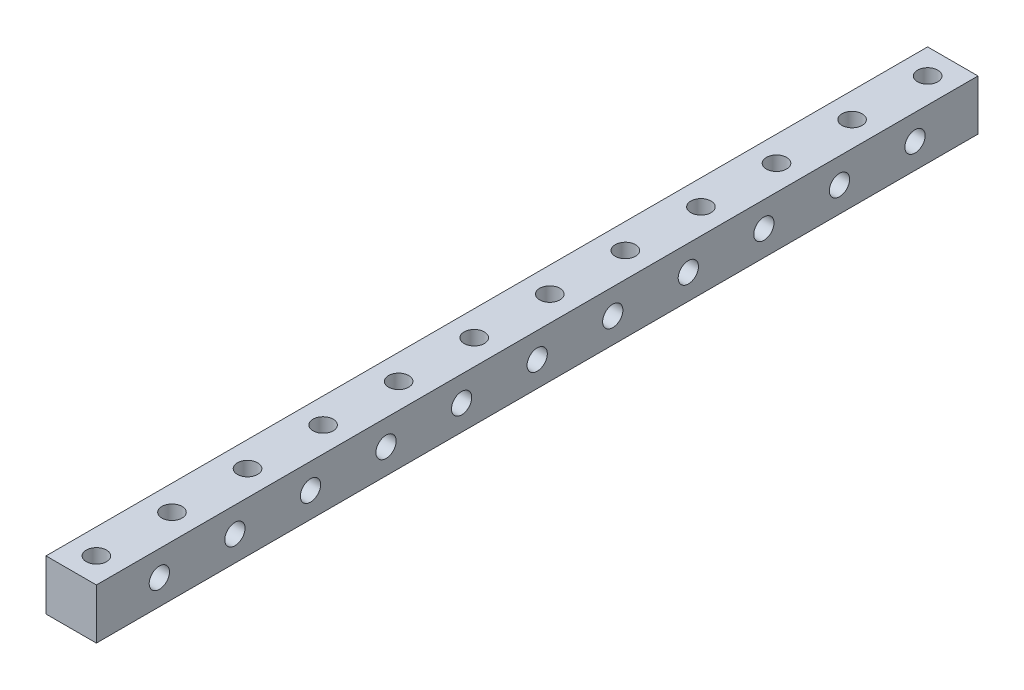
ISO-10303-21;
HEADER;
FILE_DESCRIPTION(('STEP AP214'),'2;1');
FILE_NAME('part.step','',(''),(''),'','','');
FILE_SCHEMA(('AUTOMOTIVE_DESIGN { 1 0 10303 214 1 1 1 1 }'));
ENDSEC;
DATA;
#1=APPLICATION_CONTEXT('core data for automotive mechanical design processes');
#2=APPLICATION_PROTOCOL_DEFINITION('international standard','automotive_design',2000,#1);
#3=PRODUCT_CONTEXT('',#1,'mechanical');
#4=PRODUCT('Part','Part','',(#3));
#5=PRODUCT_RELATED_PRODUCT_CATEGORY('part','',(#4));
#6=PRODUCT_DEFINITION_FORMATION('','',#4);
#7=PRODUCT_DEFINITION_CONTEXT('part definition',#1,'design');
#8=PRODUCT_DEFINITION('design','',#6,#7);
#9=PRODUCT_DEFINITION_SHAPE('','',#8);
#10=(LENGTH_UNIT() NAMED_UNIT(*) SI_UNIT(.MILLI.,.METRE.));
#11=(NAMED_UNIT(*) PLANE_ANGLE_UNIT() SI_UNIT($,.RADIAN.));
#12=(NAMED_UNIT(*) SI_UNIT($,.STERADIAN.) SOLID_ANGLE_UNIT());
#13=UNCERTAINTY_MEASURE_WITH_UNIT(LENGTH_MEASURE(1.E-05),#10,'distance_accuracy_value','');
#14=(GEOMETRIC_REPRESENTATION_CONTEXT(3) GLOBAL_UNCERTAINTY_ASSIGNED_CONTEXT((#13)) GLOBAL_UNIT_ASSIGNED_CONTEXT((#10,
#11,#12)) REPRESENTATION_CONTEXT('',''));
#15=CARTESIAN_POINT('',(0.,0.,0.));
#16=DIRECTION('',(0.,0.,1.));
#17=DIRECTION('',(1.,0.,0.));
#18=AXIS2_PLACEMENT_3D('',#15,#16,#17);
#19=CARTESIAN_POINT('',(6.35,0.,-206.375));
#20=DIRECTION('',(1.,0.,0.));
#21=DIRECTION('',(0.,0.,-1.));
#22=AXIS2_PLACEMENT_3D('',#19,#20,#21);
#23=CYLINDRICAL_SURFACE('',#22,2.55269999999999);
#24=CARTESIAN_POINT('',(6.35,0.,-206.375));
#25=DIRECTION('',(1.,0.,0.));
#26=DIRECTION('',(0.,0.,-1.));
#27=AXIS2_PLACEMENT_3D('',#24,#25,#26);
#28=CIRCLE('',#27,2.55269999999999);
#29=CARTESIAN_POINT('',(6.35,0.,-208.9277));
#30=VERTEX_POINT('',#29);
#31=EDGE_CURVE('E132',#30,#30,#28,.F.);
#32=ORIENTED_EDGE('',*,*,#31,.F.);
#33=EDGE_LOOP('',(#32));
#34=FACE_BOUND('',#33,.T.);
#35=CARTESIAN_POINT('',(-6.35,0.,-206.375));
#36=DIRECTION('',(1.,0.,0.));
#37=DIRECTION('',(0.,0.,-1.));
#38=AXIS2_PLACEMENT_3D('',#35,#36,#37);
#39=CIRCLE('',#38,2.55269999999999);
#40=CARTESIAN_POINT('',(-6.35,0.,-208.9277));
#41=VERTEX_POINT('',#40);
#42=EDGE_CURVE('E223',#41,#41,#39,.T.);
#43=ORIENTED_EDGE('',*,*,#42,.F.);
#44=EDGE_LOOP('',(#43));
#45=FACE_BOUND('',#44,.T.);
#46=ADVANCED_FACE('F50',(#34,#45),#23,.F.);
#47=CARTESIAN_POINT('',(6.35,0.,-187.325));
#48=DIRECTION('',(1.,0.,0.));
#49=DIRECTION('',(0.,0.,-1.));
#50=AXIS2_PLACEMENT_3D('',#47,#48,#49);
#51=CYLINDRICAL_SURFACE('',#50,2.55269999999999);
#52=CARTESIAN_POINT('',(6.35,0.,-187.325));
#53=DIRECTION('',(1.,0.,0.));
#54=DIRECTION('',(0.,0.,-1.));
#55=AXIS2_PLACEMENT_3D('',#52,#53,#54);
#56=CIRCLE('',#55,2.55269999999999);
#57=CARTESIAN_POINT('',(6.35,0.,-189.8777));
#58=VERTEX_POINT('',#57);
#59=EDGE_CURVE('E373',#58,#58,#56,.F.);
#60=ORIENTED_EDGE('',*,*,#59,.F.);
#61=EDGE_LOOP('',(#60));
#62=FACE_BOUND('',#61,.T.);
#63=CARTESIAN_POINT('',(-6.35,0.,-187.325));
#64=DIRECTION('',(1.,0.,0.));
#65=DIRECTION('',(0.,0.,-1.));
#66=AXIS2_PLACEMENT_3D('',#63,#64,#65);
#67=CIRCLE('',#66,2.55269999999999);
#68=CARTESIAN_POINT('',(-6.35,0.,-189.8777));
#69=VERTEX_POINT('',#68);
#70=EDGE_CURVE('E169',#69,#69,#67,.T.);
#71=ORIENTED_EDGE('',*,*,#70,.F.);
#72=EDGE_LOOP('',(#71));
#73=FACE_BOUND('',#72,.T.);
#74=ADVANCED_FACE('F385',(#62,#73),#51,.F.);
#75=CARTESIAN_POINT('',(6.35,0.,-168.275));
#76=DIRECTION('',(1.,0.,0.));
#77=DIRECTION('',(0.,0.,-1.));
#78=AXIS2_PLACEMENT_3D('',#75,#76,#77);
#79=CYLINDRICAL_SURFACE('',#78,2.55269999999999);
#80=CARTESIAN_POINT('',(6.35,0.,-168.275));
#81=DIRECTION('',(1.,0.,0.));
#82=DIRECTION('',(0.,0.,-1.));
#83=AXIS2_PLACEMENT_3D('',#80,#81,#82);
#84=CIRCLE('',#83,2.55269999999999);
#85=CARTESIAN_POINT('',(6.35,0.,-170.8277));
#86=VERTEX_POINT('',#85);
#87=EDGE_CURVE('E370',#86,#86,#84,.F.);
#88=ORIENTED_EDGE('',*,*,#87,.F.);
#89=EDGE_LOOP('',(#88));
#90=FACE_BOUND('',#89,.T.);
#91=CARTESIAN_POINT('',(-6.35,0.,-168.275));
#92=DIRECTION('',(1.,0.,0.));
#93=DIRECTION('',(0.,0.,-1.));
#94=AXIS2_PLACEMENT_3D('',#91,#92,#93);
#95=CIRCLE('',#94,2.55269999999999);
#96=CARTESIAN_POINT('',(-6.35,0.,-170.8277));
#97=VERTEX_POINT('',#96);
#98=EDGE_CURVE('E219',#97,#97,#95,.T.);
#99=ORIENTED_EDGE('',*,*,#98,.F.);
#100=EDGE_LOOP('',(#99));
#101=FACE_BOUND('',#100,.T.);
#102=ADVANCED_FACE('F389',(#90,#101),#79,.F.);
#103=CARTESIAN_POINT('',(6.35,0.,-149.225));
#104=DIRECTION('',(1.,0.,0.));
#105=DIRECTION('',(0.,0.,-1.));
#106=AXIS2_PLACEMENT_3D('',#103,#104,#105);
#107=CYLINDRICAL_SURFACE('',#106,2.55269999999999);
#108=CARTESIAN_POINT('',(6.35,0.,-149.225));
#109=DIRECTION('',(1.,0.,0.));
#110=DIRECTION('',(0.,0.,-1.));
#111=AXIS2_PLACEMENT_3D('',#108,#109,#110);
#112=CIRCLE('',#111,2.55269999999999);
#113=CARTESIAN_POINT('',(6.35,0.,-151.7777));
#114=VERTEX_POINT('',#113);
#115=EDGE_CURVE('E366',#114,#114,#112,.F.);
#116=ORIENTED_EDGE('',*,*,#115,.F.);
#117=EDGE_LOOP('',(#116));
#118=FACE_BOUND('',#117,.T.);
#119=CARTESIAN_POINT('',(-6.35,0.,-149.225));
#120=DIRECTION('',(1.,0.,0.));
#121=DIRECTION('',(0.,0.,-1.));
#122=AXIS2_PLACEMENT_3D('',#119,#120,#121);
#123=CIRCLE('',#122,2.55269999999999);
#124=CARTESIAN_POINT('',(-6.35,0.,-151.7777));
#125=VERTEX_POINT('',#124);
#126=EDGE_CURVE('E174',#125,#125,#123,.T.);
#127=ORIENTED_EDGE('',*,*,#126,.F.);
#128=EDGE_LOOP('',(#127));
#129=FACE_BOUND('',#128,.T.);
#130=ADVANCED_FACE('F485',(#118,#129),#107,.F.);
#131=CARTESIAN_POINT('',(6.35,0.,-130.175));
#132=DIRECTION('',(1.,0.,0.));
#133=DIRECTION('',(0.,0.,-1.));
#134=AXIS2_PLACEMENT_3D('',#131,#132,#133);
#135=CYLINDRICAL_SURFACE('',#134,2.55269999999999);
#136=CARTESIAN_POINT('',(6.35,0.,-130.175));
#137=DIRECTION('',(1.,0.,0.));
#138=DIRECTION('',(0.,0.,-1.));
#139=AXIS2_PLACEMENT_3D('',#136,#137,#138);
#140=CIRCLE('',#139,2.55269999999999);
#141=CARTESIAN_POINT('',(6.35,0.,-132.7277));
#142=VERTEX_POINT('',#141);
#143=EDGE_CURVE('E362',#142,#142,#140,.F.);
#144=ORIENTED_EDGE('',*,*,#143,.F.);
#145=EDGE_LOOP('',(#144));
#146=FACE_BOUND('',#145,.T.);
#147=CARTESIAN_POINT('',(-6.35,0.,-130.175));
#148=DIRECTION('',(1.,0.,0.));
#149=DIRECTION('',(0.,0.,-1.));
#150=AXIS2_PLACEMENT_3D('',#147,#148,#149);
#151=CIRCLE('',#150,2.55269999999999);
#152=CARTESIAN_POINT('',(-6.35,0.,-132.7277));
#153=VERTEX_POINT('',#152);
#154=EDGE_CURVE('E180',#153,#153,#151,.T.);
#155=ORIENTED_EDGE('',*,*,#154,.F.);
#156=EDGE_LOOP('',(#155));
#157=FACE_BOUND('',#156,.T.);
#158=ADVANCED_FACE('F481',(#146,#157),#135,.F.);
#159=CARTESIAN_POINT('',(6.35,0.,-111.125));
#160=DIRECTION('',(1.,0.,0.));
#161=DIRECTION('',(0.,0.,-1.));
#162=AXIS2_PLACEMENT_3D('',#159,#160,#161);
#163=CYLINDRICAL_SURFACE('',#162,2.55269999999999);
#164=CARTESIAN_POINT('',(6.35,0.,-111.125));
#165=DIRECTION('',(1.,0.,0.));
#166=DIRECTION('',(0.,0.,-1.));
#167=AXIS2_PLACEMENT_3D('',#164,#165,#166);
#168=CIRCLE('',#167,2.55269999999999);
#169=CARTESIAN_POINT('',(6.35,0.,-113.6777));
#170=VERTEX_POINT('',#169);
#171=EDGE_CURVE('E358',#170,#170,#168,.F.);
#172=ORIENTED_EDGE('',*,*,#171,.F.);
#173=EDGE_LOOP('',(#172));
#174=FACE_BOUND('',#173,.T.);
#175=CARTESIAN_POINT('',(-6.35,0.,-111.125));
#176=DIRECTION('',(1.,0.,0.));
#177=DIRECTION('',(0.,0.,-1.));
#178=AXIS2_PLACEMENT_3D('',#175,#176,#177);
#179=CIRCLE('',#178,2.55269999999999);
#180=CARTESIAN_POINT('',(-6.35,0.,-113.6777));
#181=VERTEX_POINT('',#180);
#182=EDGE_CURVE('E185',#181,#181,#179,.T.);
#183=ORIENTED_EDGE('',*,*,#182,.F.);
#184=EDGE_LOOP('',(#183));
#185=FACE_BOUND('',#184,.T.);
#186=ADVANCED_FACE('F477',(#174,#185),#163,.F.);
#187=CARTESIAN_POINT('',(6.35,0.,-92.075));
#188=DIRECTION('',(1.,0.,0.));
#189=DIRECTION('',(0.,0.,-1.));
#190=AXIS2_PLACEMENT_3D('',#187,#188,#189);
#191=CYLINDRICAL_SURFACE('',#190,2.55270000000001);
#192=CARTESIAN_POINT('',(6.35,0.,-92.075));
#193=DIRECTION('',(1.,0.,0.));
#194=DIRECTION('',(0.,0.,-1.));
#195=AXIS2_PLACEMENT_3D('',#192,#193,#194);
#196=CIRCLE('',#195,2.55270000000001);
#197=CARTESIAN_POINT('',(6.35,0.,-94.6277));
#198=VERTEX_POINT('',#197);
#199=EDGE_CURVE('E354',#198,#198,#196,.F.);
#200=ORIENTED_EDGE('',*,*,#199,.F.);
#201=EDGE_LOOP('',(#200));
#202=FACE_BOUND('',#201,.T.);
#203=CARTESIAN_POINT('',(-6.35,0.,-92.075));
#204=DIRECTION('',(1.,0.,0.));
#205=DIRECTION('',(0.,0.,-1.));
#206=AXIS2_PLACEMENT_3D('',#203,#204,#205);
#207=CIRCLE('',#206,2.55270000000001);
#208=CARTESIAN_POINT('',(-6.35,0.,-94.6277));
#209=VERTEX_POINT('',#208);
#210=EDGE_CURVE('E193',#209,#209,#207,.T.);
#211=ORIENTED_EDGE('',*,*,#210,.F.);
#212=EDGE_LOOP('',(#211));
#213=FACE_BOUND('',#212,.T.);
#214=ADVANCED_FACE('F473',(#202,#213),#191,.F.);
#215=CARTESIAN_POINT('',(6.35,0.,-73.025));
#216=DIRECTION('',(1.,0.,0.));
#217=DIRECTION('',(0.,0.,-1.));
#218=AXIS2_PLACEMENT_3D('',#215,#216,#217);
#219=CYLINDRICAL_SURFACE('',#218,2.55269999999999);
#220=CARTESIAN_POINT('',(6.35,0.,-73.025));
#221=DIRECTION('',(1.,0.,0.));
#222=DIRECTION('',(0.,0.,-1.));
#223=AXIS2_PLACEMENT_3D('',#220,#221,#222);
#224=CIRCLE('',#223,2.55269999999999);
#225=CARTESIAN_POINT('',(6.35,0.,-75.5777));
#226=VERTEX_POINT('',#225);
#227=EDGE_CURVE('E350',#226,#226,#224,.F.);
#228=ORIENTED_EDGE('',*,*,#227,.F.);
#229=EDGE_LOOP('',(#228));
#230=FACE_BOUND('',#229,.T.);
#231=CARTESIAN_POINT('',(-6.35,0.,-73.025));
#232=DIRECTION('',(1.,0.,0.));
#233=DIRECTION('',(0.,0.,-1.));
#234=AXIS2_PLACEMENT_3D('',#231,#232,#233);
#235=CIRCLE('',#234,2.55269999999999);
#236=CARTESIAN_POINT('',(-6.35,0.,-75.5777));
#237=VERTEX_POINT('',#236);
#238=EDGE_CURVE('E197',#237,#237,#235,.T.);
#239=ORIENTED_EDGE('',*,*,#238,.F.);
#240=EDGE_LOOP('',(#239));
#241=FACE_BOUND('',#240,.T.);
#242=ADVANCED_FACE('F469',(#230,#241),#219,.F.);
#243=CARTESIAN_POINT('',(6.35,0.,-53.975));
#244=DIRECTION('',(1.,0.,0.));
#245=DIRECTION('',(0.,0.,-1.));
#246=AXIS2_PLACEMENT_3D('',#243,#244,#245);
#247=CYLINDRICAL_SURFACE('',#246,2.5527);
#248=CARTESIAN_POINT('',(6.35,0.,-53.975));
#249=DIRECTION('',(1.,0.,0.));
#250=DIRECTION('',(0.,0.,-1.));
#251=AXIS2_PLACEMENT_3D('',#248,#249,#250);
#252=CIRCLE('',#251,2.5527);
#253=CARTESIAN_POINT('',(6.35,0.,-56.5277));
#254=VERTEX_POINT('',#253);
#255=EDGE_CURVE('E346',#254,#254,#252,.F.);
#256=ORIENTED_EDGE('',*,*,#255,.F.);
#257=EDGE_LOOP('',(#256));
#258=FACE_BOUND('',#257,.T.);
#259=CARTESIAN_POINT('',(-6.35,0.,-53.975));
#260=DIRECTION('',(1.,0.,0.));
#261=DIRECTION('',(0.,0.,-1.));
#262=AXIS2_PLACEMENT_3D('',#259,#260,#261);
#263=CIRCLE('',#262,2.5527);
#264=CARTESIAN_POINT('',(-6.35,0.,-56.5277));
#265=VERTEX_POINT('',#264);
#266=EDGE_CURVE('E202',#265,#265,#263,.T.);
#267=ORIENTED_EDGE('',*,*,#266,.F.);
#268=EDGE_LOOP('',(#267));
#269=FACE_BOUND('',#268,.T.);
#270=ADVANCED_FACE('F465',(#258,#269),#247,.F.);
#271=CARTESIAN_POINT('',(6.35,0.,-34.925));
#272=DIRECTION('',(1.,0.,0.));
#273=DIRECTION('',(0.,0.,-1.));
#274=AXIS2_PLACEMENT_3D('',#271,#272,#273);
#275=CYLINDRICAL_SURFACE('',#274,2.5527);
#276=CARTESIAN_POINT('',(6.35,0.,-34.925));
#277=DIRECTION('',(1.,0.,0.));
#278=DIRECTION('',(0.,0.,-1.));
#279=AXIS2_PLACEMENT_3D('',#276,#277,#278);
#280=CIRCLE('',#279,2.5527);
#281=CARTESIAN_POINT('',(6.35,0.,-37.4777));
#282=VERTEX_POINT('',#281);
#283=EDGE_CURVE('E342',#282,#282,#280,.F.);
#284=ORIENTED_EDGE('',*,*,#283,.F.);
#285=EDGE_LOOP('',(#284));
#286=FACE_BOUND('',#285,.T.);
#287=CARTESIAN_POINT('',(-6.35,0.,-34.925));
#288=DIRECTION('',(1.,0.,0.));
#289=DIRECTION('',(0.,0.,-1.));
#290=AXIS2_PLACEMENT_3D('',#287,#288,#289);
#291=CIRCLE('',#290,2.5527);
#292=CARTESIAN_POINT('',(-6.35,0.,-37.4777));
#293=VERTEX_POINT('',#292);
#294=EDGE_CURVE('E207',#293,#293,#291,.T.);
#295=ORIENTED_EDGE('',*,*,#294,.F.);
#296=EDGE_LOOP('',(#295));
#297=FACE_BOUND('',#296,.T.);
#298=ADVANCED_FACE('F461',(#286,#297),#275,.F.);
#299=CARTESIAN_POINT('',(6.35,0.,-15.875));
#300=DIRECTION('',(1.,0.,0.));
#301=DIRECTION('',(0.,0.,-1.));
#302=AXIS2_PLACEMENT_3D('',#299,#300,#301);
#303=CYLINDRICAL_SURFACE('',#302,2.5527);
#304=CARTESIAN_POINT('',(6.35,0.,-15.875));
#305=DIRECTION('',(1.,0.,0.));
#306=DIRECTION('',(0.,0.,-1.));
#307=AXIS2_PLACEMENT_3D('',#304,#305,#306);
#308=CIRCLE('',#307,2.5527);
#309=CARTESIAN_POINT('',(6.35,0.,-18.4277));
#310=VERTEX_POINT('',#309);
#311=EDGE_CURVE('E338',#310,#310,#308,.F.);
#312=ORIENTED_EDGE('',*,*,#311,.F.);
#313=EDGE_LOOP('',(#312));
#314=FACE_BOUND('',#313,.T.);
#315=CARTESIAN_POINT('',(-6.35,0.,-15.875));
#316=DIRECTION('',(1.,0.,0.));
#317=DIRECTION('',(0.,0.,-1.));
#318=AXIS2_PLACEMENT_3D('',#315,#316,#317);
#319=CIRCLE('',#318,2.5527);
#320=CARTESIAN_POINT('',(-6.35,0.,-18.4277));
#321=VERTEX_POINT('',#320);
#322=EDGE_CURVE('E215',#321,#321,#319,.T.);
#323=ORIENTED_EDGE('',*,*,#322,.F.);
#324=EDGE_LOOP('',(#323));
#325=FACE_BOUND('',#324,.T.);
#326=ADVANCED_FACE('F457',(#314,#325),#303,.F.);
#327=CARTESIAN_POINT('',(6.35,-6.35,-304.8));
#328=DIRECTION('',(0.,-1.,0.));
#329=DIRECTION('',(1.,0.,0.));
#330=AXIS2_PLACEMENT_3D('',#327,#328,#329);
#331=PLANE('',#330);
#332=DIRECTION('',(1.,0.,0.));
#333=VECTOR('',#332,1.);
#334=CARTESIAN_POINT('',(-19.05,-6.35,-222.25));
#335=LINE('',#334,#333);
#336=CARTESIAN_POINT('',(-6.35,-6.35,-222.25));
#337=VERTEX_POINT('',#336);
#338=CARTESIAN_POINT('',(6.35,-6.35,-222.25));
#339=VERTEX_POINT('',#338);
#340=EDGE_CURVE('E92',#337,#339,#335,.T.);
#341=ORIENTED_EDGE('',*,*,#340,.T.);
#342=DIRECTION('',(0.,0.,-1.));
#343=VECTOR('',#342,1.);
#344=CARTESIAN_POINT('',(6.35,-6.35,-304.8));
#345=LINE('',#344,#343);
#346=CARTESIAN_POINT('',(6.35,-6.35,0.));
#347=VERTEX_POINT('',#346);
#348=EDGE_CURVE('E108',#347,#339,#345,.T.);
#349=ORIENTED_EDGE('',*,*,#348,.F.);
#350=DIRECTION('',(1.,0.,0.));
#351=VECTOR('',#350,1.);
#352=CARTESIAN_POINT('',(-6.35,-6.35,0.));
#353=LINE('',#352,#351);
#354=CARTESIAN_POINT('',(-6.35,-6.35000000000003,0.));
#355=VERTEX_POINT('',#354);
#356=EDGE_CURVE('E135',#355,#347,#353,.T.);
#357=ORIENTED_EDGE('',*,*,#356,.F.);
#358=DIRECTION('',(0.,0.,1.));
#359=VECTOR('',#358,1.);
#360=CARTESIAN_POINT('',(-6.35,-6.35000000000005,-304.8));
#361=LINE('',#360,#359);
#362=EDGE_CURVE('E87',#337,#355,#361,.T.);
#363=ORIENTED_EDGE('',*,*,#362,.F.);
#364=EDGE_LOOP('',(#341,#349,#357,#363));
#365=FACE_BOUND('',#364,.T.);
#366=CARTESIAN_POINT('',(0.,-6.35,-215.9));
#367=DIRECTION('',(0.,1.,0.));
#368=DIRECTION('',(0.,0.,1.));
#369=AXIS2_PLACEMENT_3D('',#366,#367,#368);
#370=CIRCLE('',#369,2.55269999999999);
#371=CARTESIAN_POINT('',(0.,-6.35,-213.3473));
#372=VERTEX_POINT('',#371);
#373=EDGE_CURVE('E333',#372,#372,#370,.T.);
#374=ORIENTED_EDGE('',*,*,#373,.T.);
#375=EDGE_LOOP('',(#374));
#376=FACE_BOUND('',#375,.T.);
#377=CARTESIAN_POINT('',(0.,-6.35,-196.85));
#378=DIRECTION('',(0.,1.,0.));
#379=DIRECTION('',(0.,0.,1.));
#380=AXIS2_PLACEMENT_3D('',#377,#378,#379);
#381=CIRCLE('',#380,2.55269999999999);
#382=CARTESIAN_POINT('',(0.,-6.35,-194.2973));
#383=VERTEX_POINT('',#382);
#384=EDGE_CURVE('E329',#383,#383,#381,.T.);
#385=ORIENTED_EDGE('',*,*,#384,.T.);
#386=EDGE_LOOP('',(#385));
#387=FACE_BOUND('',#386,.T.);
#388=CARTESIAN_POINT('',(0.,-6.35,-177.8));
#389=DIRECTION('',(0.,1.,0.));
#390=DIRECTION('',(0.,0.,1.));
#391=AXIS2_PLACEMENT_3D('',#388,#389,#390);
#392=CIRCLE('',#391,2.55269999999999);
#393=CARTESIAN_POINT('',(0.,-6.35,-175.2473));
#394=VERTEX_POINT('',#393);
#395=EDGE_CURVE('E325',#394,#394,#392,.T.);
#396=ORIENTED_EDGE('',*,*,#395,.T.);
#397=EDGE_LOOP('',(#396));
#398=FACE_BOUND('',#397,.T.);
#399=CARTESIAN_POINT('',(0.,-6.35,-158.75));
#400=DIRECTION('',(0.,1.,0.));
#401=DIRECTION('',(0.,0.,1.));
#402=AXIS2_PLACEMENT_3D('',#399,#400,#401);
#403=CIRCLE('',#402,2.55269999999999);
#404=CARTESIAN_POINT('',(0.,-6.35,-156.1973));
#405=VERTEX_POINT('',#404);
#406=EDGE_CURVE('E320',#405,#405,#403,.T.);
#407=ORIENTED_EDGE('',*,*,#406,.T.);
#408=EDGE_LOOP('',(#407));
#409=FACE_BOUND('',#408,.T.);
#410=CARTESIAN_POINT('',(0.,-6.35,-139.7));
#411=DIRECTION('',(0.,1.,0.));
#412=DIRECTION('',(0.,0.,1.));
#413=AXIS2_PLACEMENT_3D('',#410,#411,#412);
#414=CIRCLE('',#413,2.55269999999999);
#415=CARTESIAN_POINT('',(0.,-6.35,-137.1473));
#416=VERTEX_POINT('',#415);
#417=EDGE_CURVE('E315',#416,#416,#414,.T.);
#418=ORIENTED_EDGE('',*,*,#417,.T.);
#419=EDGE_LOOP('',(#418));
#420=FACE_BOUND('',#419,.T.);
#421=CARTESIAN_POINT('',(0.,-6.35,-120.65));
#422=DIRECTION('',(0.,1.,0.));
#423=DIRECTION('',(0.,0.,1.));
#424=AXIS2_PLACEMENT_3D('',#421,#422,#423);
#425=CIRCLE('',#424,2.55269999999999);
#426=CARTESIAN_POINT('',(0.,-6.35,-118.0973));
#427=VERTEX_POINT('',#426);
#428=EDGE_CURVE('E311',#427,#427,#425,.T.);
#429=ORIENTED_EDGE('',*,*,#428,.T.);
#430=EDGE_LOOP('',(#429));
#431=FACE_BOUND('',#430,.T.);
#432=CARTESIAN_POINT('',(0.,-6.35,-101.6));
#433=DIRECTION('',(0.,1.,0.));
#434=DIRECTION('',(0.,0.,1.));
#435=AXIS2_PLACEMENT_3D('',#432,#433,#434);
#436=CIRCLE('',#435,2.55269999999999);
#437=CARTESIAN_POINT('',(0.,-6.35,-99.0473));
#438=VERTEX_POINT('',#437);
#439=EDGE_CURVE('E303',#438,#438,#436,.T.);
#440=ORIENTED_EDGE('',*,*,#439,.T.);
#441=EDGE_LOOP('',(#440));
#442=FACE_BOUND('',#441,.T.);
#443=CARTESIAN_POINT('',(0.,-6.35,-82.55));
#444=DIRECTION('',(0.,1.,0.));
#445=DIRECTION('',(0.,0.,1.));
#446=AXIS2_PLACEMENT_3D('',#443,#444,#445);
#447=CIRCLE('',#446,2.55269999999999);
#448=CARTESIAN_POINT('',(0.,-6.35,-79.9973));
#449=VERTEX_POINT('',#448);
#450=EDGE_CURVE('E298',#449,#449,#447,.T.);
#451=ORIENTED_EDGE('',*,*,#450,.T.);
#452=EDGE_LOOP('',(#451));
#453=FACE_BOUND('',#452,.T.);
#454=CARTESIAN_POINT('',(0.,-6.35,-63.5));
#455=DIRECTION('',(0.,1.,0.));
#456=DIRECTION('',(0.,0.,1.));
#457=AXIS2_PLACEMENT_3D('',#454,#455,#456);
#458=CIRCLE('',#457,2.5527);
#459=CARTESIAN_POINT('',(0.,-6.35,-60.9473));
#460=VERTEX_POINT('',#459);
#461=EDGE_CURVE('E293',#460,#460,#458,.T.);
#462=ORIENTED_EDGE('',*,*,#461,.T.);
#463=EDGE_LOOP('',(#462));
#464=FACE_BOUND('',#463,.T.);
#465=CARTESIAN_POINT('',(0.,-6.35,-44.45));
#466=DIRECTION('',(0.,1.,0.));
#467=DIRECTION('',(0.,0.,1.));
#468=AXIS2_PLACEMENT_3D('',#465,#466,#467);
#469=CIRCLE('',#468,2.5527);
#470=CARTESIAN_POINT('',(0.,-6.35,-41.8973));
#471=VERTEX_POINT('',#470);
#472=EDGE_CURVE('E289',#471,#471,#469,.T.);
#473=ORIENTED_EDGE('',*,*,#472,.T.);
#474=EDGE_LOOP('',(#473));
#475=FACE_BOUND('',#474,.T.);
#476=CARTESIAN_POINT('',(0.,-6.35,-25.4));
#477=DIRECTION('',(0.,1.,0.));
#478=DIRECTION('',(0.,0.,1.));
#479=AXIS2_PLACEMENT_3D('',#476,#477,#478);
#480=CIRCLE('',#479,2.5527);
#481=CARTESIAN_POINT('',(0.,-6.35,-22.8473));
#482=VERTEX_POINT('',#481);
#483=EDGE_CURVE('E280',#482,#482,#480,.T.);
#484=ORIENTED_EDGE('',*,*,#483,.T.);
#485=EDGE_LOOP('',(#484));
#486=FACE_BOUND('',#485,.T.);
#487=CARTESIAN_POINT('',(0.,-6.35,-6.35));
#488=DIRECTION('',(0.,1.,0.));
#489=DIRECTION('',(0.,0.,1.));
#490=AXIS2_PLACEMENT_3D('',#487,#488,#489);
#491=CIRCLE('',#490,2.5527);
#492=CARTESIAN_POINT('',(0.,-6.35,-3.7973));
#493=VERTEX_POINT('',#492);
#494=EDGE_CURVE('E129',#493,#493,#491,.T.);
#495=ORIENTED_EDGE('',*,*,#494,.T.);
#496=EDGE_LOOP('',(#495));
#497=FACE_BOUND('',#496,.T.);
#498=ADVANCED_FACE('F454',(#365,#376,#387,#398,#409,#420,#431,#442,#453,#464,#475,#486,#497),
#331,.T.);
#499=CARTESIAN_POINT('',(-6.35,-6.35,-304.8));
#500=DIRECTION('',(-1.,0.,0.));
#501=DIRECTION('',(0.,0.,1.));
#502=AXIS2_PLACEMENT_3D('',#499,#500,#501);
#503=PLANE('',#502);
#504=DIRECTION('',(0.,1.,0.));
#505=VECTOR('',#504,1.);
#506=CARTESIAN_POINT('',(-6.35,-6.35,-222.25));
#507=LINE('',#506,#505);
#508=CARTESIAN_POINT('',(-6.35,6.35,-222.25));
#509=VERTEX_POINT('',#508);
#510=EDGE_CURVE('E64',#337,#509,#507,.T.);
#511=ORIENTED_EDGE('',*,*,#510,.F.);
#512=ORIENTED_EDGE('',*,*,#362,.T.);
#513=DIRECTION('',(0.,1.,0.));
#514=VECTOR('',#513,1.);
#515=CARTESIAN_POINT('',(-6.35,6.35,0.));
#516=LINE('',#515,#514);
#517=CARTESIAN_POINT('',(-6.35,6.35,0.));
#518=VERTEX_POINT('',#517);
#519=EDGE_CURVE('E139',#518,#355,#516,.F.);
#520=ORIENTED_EDGE('',*,*,#519,.F.);
#521=DIRECTION('',(0.,0.,1.));
#522=VECTOR('',#521,1.);
#523=CARTESIAN_POINT('',(-6.35,6.35,-304.8));
#524=LINE('',#523,#522);
#525=EDGE_CURVE('E122',#509,#518,#524,.T.);
#526=ORIENTED_EDGE('',*,*,#525,.F.);
#527=EDGE_LOOP('',(#511,#512,#520,#526));
#528=FACE_BOUND('',#527,.T.);
#529=ORIENTED_EDGE('',*,*,#70,.T.);
#530=EDGE_LOOP('',(#529));
#531=FACE_BOUND('',#530,.T.);
#532=ORIENTED_EDGE('',*,*,#126,.T.);
#533=EDGE_LOOP('',(#532));
#534=FACE_BOUND('',#533,.T.);
#535=ORIENTED_EDGE('',*,*,#154,.T.);
#536=EDGE_LOOP('',(#535));
#537=FACE_BOUND('',#536,.T.);
#538=ORIENTED_EDGE('',*,*,#182,.T.);
#539=EDGE_LOOP('',(#538));
#540=FACE_BOUND('',#539,.T.);
#541=ORIENTED_EDGE('',*,*,#210,.T.);
#542=EDGE_LOOP('',(#541));
#543=FACE_BOUND('',#542,.T.);
#544=ORIENTED_EDGE('',*,*,#238,.T.);
#545=EDGE_LOOP('',(#544));
#546=FACE_BOUND('',#545,.T.);
#547=ORIENTED_EDGE('',*,*,#266,.T.);
#548=EDGE_LOOP('',(#547));
#549=FACE_BOUND('',#548,.T.);
#550=ORIENTED_EDGE('',*,*,#294,.T.);
#551=EDGE_LOOP('',(#550));
#552=FACE_BOUND('',#551,.T.);
#553=ORIENTED_EDGE('',*,*,#322,.T.);
#554=EDGE_LOOP('',(#553));
#555=FACE_BOUND('',#554,.T.);
#556=ORIENTED_EDGE('',*,*,#98,.T.);
#557=EDGE_LOOP('',(#556));
#558=FACE_BOUND('',#557,.T.);
#559=ORIENTED_EDGE('',*,*,#42,.T.);
#560=EDGE_LOOP('',(#559));
#561=FACE_BOUND('',#560,.T.);
#562=ADVANCED_FACE('F451',(#528,#531,#534,#537,#540,#543,#546,#549,#552,#555,#558,#561),#503,.T.);
#563=CARTESIAN_POINT('',(-6.35,6.35,0.));
#564=DIRECTION('',(0.,0.,1.));
#565=DIRECTION('',(1.,0.,0.));
#566=AXIS2_PLACEMENT_3D('',#563,#564,#565);
#567=PLANE('',#566);
#568=DIRECTION('',(0.,1.,0.));
#569=VECTOR('',#568,1.);
#570=CARTESIAN_POINT('',(6.35,-6.35,0.));
#571=LINE('',#570,#569);
#572=CARTESIAN_POINT('',(6.35,6.35,0.));
#573=VERTEX_POINT('',#572);
#574=EDGE_CURVE('E73',#573,#347,#571,.F.);
#575=ORIENTED_EDGE('',*,*,#574,.F.);
#576=DIRECTION('',(-1.,0.,0.));
#577=VECTOR('',#576,1.);
#578=CARTESIAN_POINT('',(6.35,6.35,0.));
#579=LINE('',#578,#577);
#580=EDGE_CURVE('E113',#518,#573,#579,.F.);
#581=ORIENTED_EDGE('',*,*,#580,.F.);
#582=ORIENTED_EDGE('',*,*,#519,.T.);
#583=ORIENTED_EDGE('',*,*,#356,.T.);
#584=EDGE_LOOP('',(#575,#581,#582,#583));
#585=FACE_BOUND('',#584,.T.);
#586=ADVANCED_FACE('F448',(#585),#567,.T.);
#587=CARTESIAN_POINT('',(6.35,-6.35,-304.8));
#588=DIRECTION('',(1.,0.,0.));
#589=DIRECTION('',(0.,0.,-1.));
#590=AXIS2_PLACEMENT_3D('',#587,#588,#589);
#591=PLANE('',#590);
#592=DIRECTION('',(0.,-1.,0.));
#593=VECTOR('',#592,1.);
#594=CARTESIAN_POINT('',(6.35,6.35,-222.25));
#595=LINE('',#594,#593);
#596=CARTESIAN_POINT('',(6.35,6.35,-222.25));
#597=VERTEX_POINT('',#596);
#598=EDGE_CURVE('E95',#597,#339,#595,.T.);
#599=ORIENTED_EDGE('',*,*,#598,.F.);
#600=DIRECTION('',(0.,0.,1.));
#601=VECTOR('',#600,1.);
#602=CARTESIAN_POINT('',(6.35,6.35,-304.8));
#603=LINE('',#602,#601);
#604=EDGE_CURVE('E105',#573,#597,#603,.F.);
#605=ORIENTED_EDGE('',*,*,#604,.F.);
#606=ORIENTED_EDGE('',*,*,#574,.T.);
#607=ORIENTED_EDGE('',*,*,#348,.T.);
#608=EDGE_LOOP('',(#599,#605,#606,#607));
#609=FACE_BOUND('',#608,.T.);
#610=ORIENTED_EDGE('',*,*,#311,.T.);
#611=EDGE_LOOP('',(#610));
#612=FACE_BOUND('',#611,.T.);
#613=ORIENTED_EDGE('',*,*,#283,.T.);
#614=EDGE_LOOP('',(#613));
#615=FACE_BOUND('',#614,.T.);
#616=ORIENTED_EDGE('',*,*,#255,.T.);
#617=EDGE_LOOP('',(#616));
#618=FACE_BOUND('',#617,.T.);
#619=ORIENTED_EDGE('',*,*,#227,.T.);
#620=EDGE_LOOP('',(#619));
#621=FACE_BOUND('',#620,.T.);
#622=ORIENTED_EDGE('',*,*,#199,.T.);
#623=EDGE_LOOP('',(#622));
#624=FACE_BOUND('',#623,.T.);
#625=ORIENTED_EDGE('',*,*,#171,.T.);
#626=EDGE_LOOP('',(#625));
#627=FACE_BOUND('',#626,.T.);
#628=ORIENTED_EDGE('',*,*,#143,.T.);
#629=EDGE_LOOP('',(#628));
#630=FACE_BOUND('',#629,.T.);
#631=ORIENTED_EDGE('',*,*,#115,.T.);
#632=EDGE_LOOP('',(#631));
#633=FACE_BOUND('',#632,.T.);
#634=ORIENTED_EDGE('',*,*,#87,.T.);
#635=EDGE_LOOP('',(#634));
#636=FACE_BOUND('',#635,.T.);
#637=ORIENTED_EDGE('',*,*,#59,.T.);
#638=EDGE_LOOP('',(#637));
#639=FACE_BOUND('',#638,.T.);
#640=ORIENTED_EDGE('',*,*,#31,.T.);
#641=EDGE_LOOP('',(#640));
#642=FACE_BOUND('',#641,.T.);
#643=ADVANCED_FACE('F103',(#609,#612,#615,#618,#621,#624,#627,#630,#633,#636,#639,#642),#591,.T.);
#644=CARTESIAN_POINT('',(0.,6.35,-215.9));
#645=DIRECTION('',(0.,1.,0.));
#646=DIRECTION('',(0.,0.,1.));
#647=AXIS2_PLACEMENT_3D('',#644,#645,#646);
#648=CYLINDRICAL_SURFACE('',#647,2.55269999999999);
#649=CARTESIAN_POINT('',(0.,6.35,-215.9));
#650=DIRECTION('',(0.,1.,0.));
#651=DIRECTION('',(0.,0.,1.));
#652=AXIS2_PLACEMENT_3D('',#649,#650,#651);
#653=CIRCLE('',#652,2.55269999999999);
#654=CARTESIAN_POINT('',(0.,6.35,-213.3473));
#655=VERTEX_POINT('',#654);
#656=EDGE_CURVE('E115',#655,#655,#653,.F.);
#657=ORIENTED_EDGE('',*,*,#656,.F.);
#658=EDGE_LOOP('',(#657));
#659=FACE_BOUND('',#658,.T.);
#660=ORIENTED_EDGE('',*,*,#373,.F.);
#661=EDGE_LOOP('',(#660));
#662=FACE_BOUND('',#661,.T.);
#663=ADVANCED_FACE('F441',(#659,#662),#648,.F.);
#664=CARTESIAN_POINT('',(0.,6.35,-196.85));
#665=DIRECTION('',(0.,1.,0.));
#666=DIRECTION('',(0.,0.,1.));
#667=AXIS2_PLACEMENT_3D('',#664,#665,#666);
#668=CYLINDRICAL_SURFACE('',#667,2.55269999999999);
#669=CARTESIAN_POINT('',(0.,6.35,-196.85));
#670=DIRECTION('',(0.,1.,0.));
#671=DIRECTION('',(0.,0.,1.));
#672=AXIS2_PLACEMENT_3D('',#669,#670,#671);
#673=CIRCLE('',#672,2.55269999999999);
#674=CARTESIAN_POINT('',(0.,6.35,-194.2973));
#675=VERTEX_POINT('',#674);
#676=EDGE_CURVE('E120',#675,#675,#673,.F.);
#677=ORIENTED_EDGE('',*,*,#676,.F.);
#678=EDGE_LOOP('',(#677));
#679=FACE_BOUND('',#678,.T.);
#680=ORIENTED_EDGE('',*,*,#384,.F.);
#681=EDGE_LOOP('',(#680));
#682=FACE_BOUND('',#681,.T.);
#683=ADVANCED_FACE('F437',(#679,#682),#668,.F.);
#684=CARTESIAN_POINT('',(0.,6.35,-177.8));
#685=DIRECTION('',(0.,1.,0.));
#686=DIRECTION('',(0.,0.,1.));
#687=AXIS2_PLACEMENT_3D('',#684,#685,#686);
#688=CYLINDRICAL_SURFACE('',#687,2.55269999999999);
#689=CARTESIAN_POINT('',(0.,6.35,-177.8));
#690=DIRECTION('',(0.,1.,0.));
#691=DIRECTION('',(0.,0.,1.));
#692=AXIS2_PLACEMENT_3D('',#689,#690,#691);
#693=CIRCLE('',#692,2.55269999999999);
#694=CARTESIAN_POINT('',(0.,6.35,-175.2473));
#695=VERTEX_POINT('',#694);
#696=EDGE_CURVE('E269',#695,#695,#693,.F.);
#697=ORIENTED_EDGE('',*,*,#696,.F.);
#698=EDGE_LOOP('',(#697));
#699=FACE_BOUND('',#698,.T.);
#700=ORIENTED_EDGE('',*,*,#395,.F.);
#701=EDGE_LOOP('',(#700));
#702=FACE_BOUND('',#701,.T.);
#703=ADVANCED_FACE('F433',(#699,#702),#688,.F.);
#704=CARTESIAN_POINT('',(0.,6.35,-158.75));
#705=DIRECTION('',(0.,1.,0.));
#706=DIRECTION('',(0.,0.,1.));
#707=AXIS2_PLACEMENT_3D('',#704,#705,#706);
#708=CYLINDRICAL_SURFACE('',#707,2.55269999999999);
#709=CARTESIAN_POINT('',(0.,6.35,-158.75));
#710=DIRECTION('',(0.,1.,0.));
#711=DIRECTION('',(0.,0.,1.));
#712=AXIS2_PLACEMENT_3D('',#709,#710,#711);
#713=CIRCLE('',#712,2.55269999999999);
#714=CARTESIAN_POINT('',(0.,6.35,-156.1973));
#715=VERTEX_POINT('',#714);
#716=EDGE_CURVE('E265',#715,#715,#713,.F.);
#717=ORIENTED_EDGE('',*,*,#716,.F.);
#718=EDGE_LOOP('',(#717));
#719=FACE_BOUND('',#718,.T.);
#720=ORIENTED_EDGE('',*,*,#406,.F.);
#721=EDGE_LOOP('',(#720));
#722=FACE_BOUND('',#721,.T.);
#723=ADVANCED_FACE('F429',(#719,#722),#708,.F.);
#724=CARTESIAN_POINT('',(0.,6.35,-139.7));
#725=DIRECTION('',(0.,1.,0.));
#726=DIRECTION('',(0.,0.,1.));
#727=AXIS2_PLACEMENT_3D('',#724,#725,#726);
#728=CYLINDRICAL_SURFACE('',#727,2.55269999999999);
#729=CARTESIAN_POINT('',(0.,6.35,-139.7));
#730=DIRECTION('',(0.,1.,0.));
#731=DIRECTION('',(0.,0.,1.));
#732=AXIS2_PLACEMENT_3D('',#729,#730,#731);
#733=CIRCLE('',#732,2.55269999999999);
#734=CARTESIAN_POINT('',(0.,6.35,-137.1473));
#735=VERTEX_POINT('',#734);
#736=EDGE_CURVE('E261',#735,#735,#733,.F.);
#737=ORIENTED_EDGE('',*,*,#736,.F.);
#738=EDGE_LOOP('',(#737));
#739=FACE_BOUND('',#738,.T.);
#740=ORIENTED_EDGE('',*,*,#417,.F.);
#741=EDGE_LOOP('',(#740));
#742=FACE_BOUND('',#741,.T.);
#743=ADVANCED_FACE('F425',(#739,#742),#728,.F.);
#744=CARTESIAN_POINT('',(0.,6.35,-120.65));
#745=DIRECTION('',(0.,1.,0.));
#746=DIRECTION('',(0.,0.,1.));
#747=AXIS2_PLACEMENT_3D('',#744,#745,#746);
#748=CYLINDRICAL_SURFACE('',#747,2.55269999999999);
#749=CARTESIAN_POINT('',(0.,6.35,-120.65));
#750=DIRECTION('',(0.,1.,0.));
#751=DIRECTION('',(0.,0.,1.));
#752=AXIS2_PLACEMENT_3D('',#749,#750,#751);
#753=CIRCLE('',#752,2.55269999999999);
#754=CARTESIAN_POINT('',(0.,6.35,-118.0973));
#755=VERTEX_POINT('',#754);
#756=EDGE_CURVE('E257',#755,#755,#753,.F.);
#757=ORIENTED_EDGE('',*,*,#756,.F.);
#758=EDGE_LOOP('',(#757));
#759=FACE_BOUND('',#758,.T.);
#760=ORIENTED_EDGE('',*,*,#428,.F.);
#761=EDGE_LOOP('',(#760));
#762=FACE_BOUND('',#761,.T.);
#763=ADVANCED_FACE('F421',(#759,#762),#748,.F.);
#764=CARTESIAN_POINT('',(0.,6.35,-101.6));
#765=DIRECTION('',(0.,1.,0.));
#766=DIRECTION('',(0.,0.,1.));
#767=AXIS2_PLACEMENT_3D('',#764,#765,#766);
#768=CYLINDRICAL_SURFACE('',#767,2.55269999999999);
#769=CARTESIAN_POINT('',(0.,6.35,-101.6));
#770=DIRECTION('',(0.,1.,0.));
#771=DIRECTION('',(0.,0.,1.));
#772=AXIS2_PLACEMENT_3D('',#769,#770,#771);
#773=CIRCLE('',#772,2.55269999999999);
#774=CARTESIAN_POINT('',(0.,6.35,-99.0473));
#775=VERTEX_POINT('',#774);
#776=EDGE_CURVE('E253',#775,#775,#773,.F.);
#777=ORIENTED_EDGE('',*,*,#776,.F.);
#778=EDGE_LOOP('',(#777));
#779=FACE_BOUND('',#778,.T.);
#780=ORIENTED_EDGE('',*,*,#439,.F.);
#781=EDGE_LOOP('',(#780));
#782=FACE_BOUND('',#781,.T.);
#783=ADVANCED_FACE('F417',(#779,#782),#768,.F.);
#784=CARTESIAN_POINT('',(0.,6.35,-82.55));
#785=DIRECTION('',(0.,1.,0.));
#786=DIRECTION('',(0.,0.,1.));
#787=AXIS2_PLACEMENT_3D('',#784,#785,#786);
#788=CYLINDRICAL_SURFACE('',#787,2.55269999999999);
#789=CARTESIAN_POINT('',(0.,6.35,-82.55));
#790=DIRECTION('',(0.,1.,0.));
#791=DIRECTION('',(0.,0.,1.));
#792=AXIS2_PLACEMENT_3D('',#789,#790,#791);
#793=CIRCLE('',#792,2.55269999999999);
#794=CARTESIAN_POINT('',(0.,6.35,-79.9973));
#795=VERTEX_POINT('',#794);
#796=EDGE_CURVE('E249',#795,#795,#793,.F.);
#797=ORIENTED_EDGE('',*,*,#796,.F.);
#798=EDGE_LOOP('',(#797));
#799=FACE_BOUND('',#798,.T.);
#800=ORIENTED_EDGE('',*,*,#450,.F.);
#801=EDGE_LOOP('',(#800));
#802=FACE_BOUND('',#801,.T.);
#803=ADVANCED_FACE('F413',(#799,#802),#788,.F.);
#804=CARTESIAN_POINT('',(0.,6.35,-63.5));
#805=DIRECTION('',(0.,1.,0.));
#806=DIRECTION('',(0.,0.,1.));
#807=AXIS2_PLACEMENT_3D('',#804,#805,#806);
#808=CYLINDRICAL_SURFACE('',#807,2.5527);
#809=CARTESIAN_POINT('',(0.,6.35,-63.5));
#810=DIRECTION('',(0.,1.,0.));
#811=DIRECTION('',(0.,0.,1.));
#812=AXIS2_PLACEMENT_3D('',#809,#810,#811);
#813=CIRCLE('',#812,2.5527);
#814=CARTESIAN_POINT('',(0.,6.35,-60.9473));
#815=VERTEX_POINT('',#814);
#816=EDGE_CURVE('E245',#815,#815,#813,.F.);
#817=ORIENTED_EDGE('',*,*,#816,.F.);
#818=EDGE_LOOP('',(#817));
#819=FACE_BOUND('',#818,.T.);
#820=ORIENTED_EDGE('',*,*,#461,.F.);
#821=EDGE_LOOP('',(#820));
#822=FACE_BOUND('',#821,.T.);
#823=ADVANCED_FACE('F409',(#819,#822),#808,.F.);
#824=CARTESIAN_POINT('',(0.,6.35,-44.45));
#825=DIRECTION('',(0.,1.,0.));
#826=DIRECTION('',(0.,0.,1.));
#827=AXIS2_PLACEMENT_3D('',#824,#825,#826);
#828=CYLINDRICAL_SURFACE('',#827,2.5527);
#829=CARTESIAN_POINT('',(0.,6.35,-44.45));
#830=DIRECTION('',(0.,1.,0.));
#831=DIRECTION('',(0.,0.,1.));
#832=AXIS2_PLACEMENT_3D('',#829,#830,#831);
#833=CIRCLE('',#832,2.5527);
#834=CARTESIAN_POINT('',(0.,6.35,-41.8973));
#835=VERTEX_POINT('',#834);
#836=EDGE_CURVE('E241',#835,#835,#833,.F.);
#837=ORIENTED_EDGE('',*,*,#836,.F.);
#838=EDGE_LOOP('',(#837));
#839=FACE_BOUND('',#838,.T.);
#840=ORIENTED_EDGE('',*,*,#472,.F.);
#841=EDGE_LOOP('',(#840));
#842=FACE_BOUND('',#841,.T.);
#843=ADVANCED_FACE('F405',(#839,#842),#828,.F.);
#844=CARTESIAN_POINT('',(0.,6.35,-25.4));
#845=DIRECTION('',(0.,1.,0.));
#846=DIRECTION('',(0.,0.,1.));
#847=AXIS2_PLACEMENT_3D('',#844,#845,#846);
#848=CYLINDRICAL_SURFACE('',#847,2.5527);
#849=CARTESIAN_POINT('',(0.,6.35,-25.4));
#850=DIRECTION('',(0.,1.,0.));
#851=DIRECTION('',(0.,0.,1.));
#852=AXIS2_PLACEMENT_3D('',#849,#850,#851);
#853=CIRCLE('',#852,2.5527);
#854=CARTESIAN_POINT('',(0.,6.35,-22.8473));
#855=VERTEX_POINT('',#854);
#856=EDGE_CURVE('E237',#855,#855,#853,.F.);
#857=ORIENTED_EDGE('',*,*,#856,.F.);
#858=EDGE_LOOP('',(#857));
#859=FACE_BOUND('',#858,.T.);
#860=ORIENTED_EDGE('',*,*,#483,.F.);
#861=EDGE_LOOP('',(#860));
#862=FACE_BOUND('',#861,.T.);
#863=ADVANCED_FACE('F399',(#859,#862),#848,.F.);
#864=CARTESIAN_POINT('',(0.,6.35,-6.35));
#865=DIRECTION('',(0.,1.,0.));
#866=DIRECTION('',(0.,0.,1.));
#867=AXIS2_PLACEMENT_3D('',#864,#865,#866);
#868=CYLINDRICAL_SURFACE('',#867,2.5527);
#869=CARTESIAN_POINT('',(0.,6.35,-6.35));
#870=DIRECTION('',(0.,1.,0.));
#871=DIRECTION('',(0.,0.,1.));
#872=AXIS2_PLACEMENT_3D('',#869,#870,#871);
#873=CIRCLE('',#872,2.5527);
#874=CARTESIAN_POINT('',(0.,6.35,-3.7973));
#875=VERTEX_POINT('',#874);
#876=EDGE_CURVE('E58',#875,#875,#873,.F.);
#877=ORIENTED_EDGE('',*,*,#876,.F.);
#878=EDGE_LOOP('',(#877));
#879=FACE_BOUND('',#878,.T.);
#880=ORIENTED_EDGE('',*,*,#494,.F.);
#881=EDGE_LOOP('',(#880));
#882=FACE_BOUND('',#881,.T.);
#883=ADVANCED_FACE('F394',(#879,#882),#868,.F.);
#884=CARTESIAN_POINT('',(6.35,6.35,-304.8));
#885=DIRECTION('',(0.,1.,0.));
#886=DIRECTION('',(-1.,0.,0.));
#887=AXIS2_PLACEMENT_3D('',#884,#885,#886);
#888=PLANE('',#887);
#889=DIRECTION('',(1.,0.,0.));
#890=VECTOR('',#889,1.);
#891=CARTESIAN_POINT('',(6.35,6.35,-222.25));
#892=LINE('',#891,#890);
#893=EDGE_CURVE('E12',#509,#597,#892,.T.);
#894=ORIENTED_EDGE('',*,*,#893,.F.);
#895=ORIENTED_EDGE('',*,*,#525,.T.);
#896=ORIENTED_EDGE('',*,*,#580,.T.);
#897=ORIENTED_EDGE('',*,*,#604,.T.);
#898=EDGE_LOOP('',(#894,#895,#896,#897));
#899=FACE_BOUND('',#898,.T.);
#900=ORIENTED_EDGE('',*,*,#876,.T.);
#901=EDGE_LOOP('',(#900));
#902=FACE_BOUND('',#901,.T.);
#903=ORIENTED_EDGE('',*,*,#856,.T.);
#904=EDGE_LOOP('',(#903));
#905=FACE_BOUND('',#904,.T.);
#906=ORIENTED_EDGE('',*,*,#836,.T.);
#907=EDGE_LOOP('',(#906));
#908=FACE_BOUND('',#907,.T.);
#909=ORIENTED_EDGE('',*,*,#816,.T.);
#910=EDGE_LOOP('',(#909));
#911=FACE_BOUND('',#910,.T.);
#912=ORIENTED_EDGE('',*,*,#796,.T.);
#913=EDGE_LOOP('',(#912));
#914=FACE_BOUND('',#913,.T.);
#915=ORIENTED_EDGE('',*,*,#776,.T.);
#916=EDGE_LOOP('',(#915));
#917=FACE_BOUND('',#916,.T.);
#918=ORIENTED_EDGE('',*,*,#756,.T.);
#919=EDGE_LOOP('',(#918));
#920=FACE_BOUND('',#919,.T.);
#921=ORIENTED_EDGE('',*,*,#736,.T.);
#922=EDGE_LOOP('',(#921));
#923=FACE_BOUND('',#922,.T.);
#924=ORIENTED_EDGE('',*,*,#716,.T.);
#925=EDGE_LOOP('',(#924));
#926=FACE_BOUND('',#925,.T.);
#927=ORIENTED_EDGE('',*,*,#696,.T.);
#928=EDGE_LOOP('',(#927));
#929=FACE_BOUND('',#928,.T.);
#930=ORIENTED_EDGE('',*,*,#676,.T.);
#931=EDGE_LOOP('',(#930));
#932=FACE_BOUND('',#931,.T.);
#933=ORIENTED_EDGE('',*,*,#656,.T.);
#934=EDGE_LOOP('',(#933));
#935=FACE_BOUND('',#934,.T.);
#936=ADVANCED_FACE('F111',(#899,#902,#905,#908,#911,#914,#917,#920,#923,#926,#929,#932,#935),
#888,.T.);
#937=CARTESIAN_POINT('',(-19.05,6.35,-222.25));
#938=DIRECTION('',(0.,0.,1.));
#939=DIRECTION('',(1.,0.,0.));
#940=AXIS2_PLACEMENT_3D('',#937,#938,#939);
#941=PLANE('',#940);
#942=ORIENTED_EDGE('',*,*,#510,.T.);
#943=ORIENTED_EDGE('',*,*,#893,.T.);
#944=ORIENTED_EDGE('',*,*,#598,.T.);
#945=ORIENTED_EDGE('',*,*,#340,.F.);
#946=EDGE_LOOP('',(#942,#943,#944,#945));
#947=FACE_BOUND('',#946,.T.);
#948=ADVANCED_FACE('F97',(#947),#941,.F.);
#949=CLOSED_SHELL('',(#46,#74,#102,#130,#158,#186,#214,#242,#270,#298,#326,#498,#562,#586,#643,
#663,#683,#703,#723,#743,#763,#783,#803,#823,#843,#863,#883,#936,#948));
#950=MANIFOLD_SOLID_BREP('B2',#949);
#951=ADVANCED_BREP_SHAPE_REPRESENTATION('',(#18,#950),#14);
#952=SHAPE_DEFINITION_REPRESENTATION(#9,#951);
ENDSEC;
END-ISO-10303-21;
